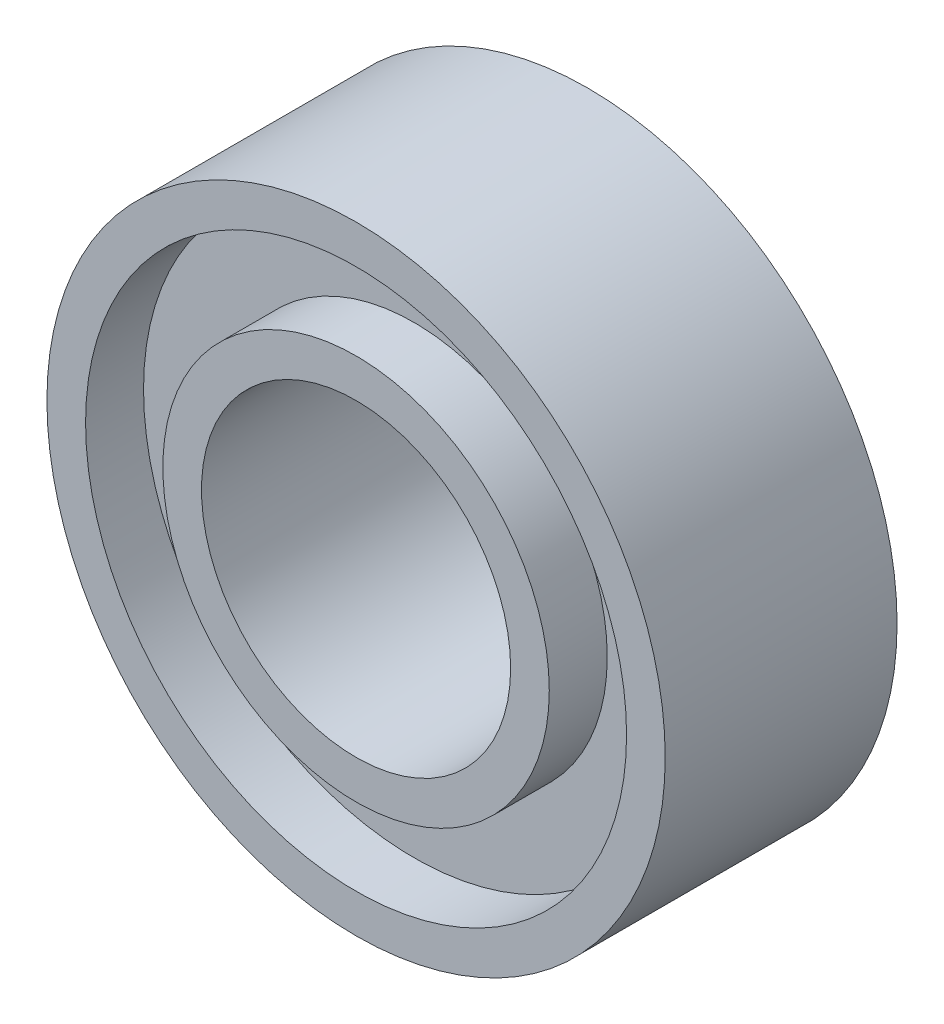
ISO-10303-21;
HEADER;
FILE_DESCRIPTION(('STEP AP214'),'2;1');
FILE_NAME('part.step','',(''),(''),'','','');
FILE_SCHEMA(('AUTOMOTIVE_DESIGN { 1 0 10303 214 1 1 1 1 }'));
ENDSEC;
DATA;
#1=APPLICATION_CONTEXT('core data for automotive mechanical design processes');
#2=APPLICATION_PROTOCOL_DEFINITION('international standard','automotive_design',2000,#1);
#3=PRODUCT_CONTEXT('',#1,'mechanical');
#4=PRODUCT('Part','Part','',(#3));
#5=PRODUCT_RELATED_PRODUCT_CATEGORY('part','',(#4));
#6=PRODUCT_DEFINITION_FORMATION('','',#4);
#7=PRODUCT_DEFINITION_CONTEXT('part definition',#1,'design');
#8=PRODUCT_DEFINITION('design','',#6,#7);
#9=PRODUCT_DEFINITION_SHAPE('','',#8);
#10=(LENGTH_UNIT() NAMED_UNIT(*) SI_UNIT(.MILLI.,.METRE.));
#11=(NAMED_UNIT(*) PLANE_ANGLE_UNIT() SI_UNIT($,.RADIAN.));
#12=(NAMED_UNIT(*) SI_UNIT($,.STERADIAN.) SOLID_ANGLE_UNIT());
#13=UNCERTAINTY_MEASURE_WITH_UNIT(LENGTH_MEASURE(1.E-05),#10,'distance_accuracy_value','');
#14=(GEOMETRIC_REPRESENTATION_CONTEXT(3) GLOBAL_UNCERTAINTY_ASSIGNED_CONTEXT((#13)) GLOBAL_UNIT_ASSIGNED_CONTEXT((#10,
#11,#12)) REPRESENTATION_CONTEXT('',''));
#15=CARTESIAN_POINT('',(0.,0.,0.));
#16=DIRECTION('',(0.,0.,1.));
#17=DIRECTION('',(1.,0.,0.));
#18=AXIS2_PLACEMENT_3D('',#15,#16,#17);
#19=CARTESIAN_POINT('',(0.,0.,0.));
#20=DIRECTION('',(0.,0.,1.));
#21=DIRECTION('',(1.,0.,0.));
#22=AXIS2_PLACEMENT_3D('',#19,#20,#21);
#23=PLANE('',#22);
#24=CARTESIAN_POINT('',(0.,0.,0.));
#25=DIRECTION('',(0.,0.,1.));
#26=DIRECTION('',(1.,0.,0.));
#27=AXIS2_PLACEMENT_3D('',#24,#25,#26);
#28=CIRCLE('',#27,4.);
#29=CARTESIAN_POINT('',(4.,0.,0.));
#30=VERTEX_POINT('',#29);
#31=EDGE_CURVE('E44',#30,#30,#28,.T.);
#32=ORIENTED_EDGE('',*,*,#31,.T.);
#33=EDGE_LOOP('',(#32));
#34=FACE_BOUND('',#33,.T.);
#35=CARTESIAN_POINT('',(0.,0.,0.));
#36=DIRECTION('',(0.,0.,1.));
#37=DIRECTION('',(1.,0.,0.));
#38=AXIS2_PLACEMENT_3D('',#35,#36,#37);
#39=CIRCLE('',#38,5.);
#40=CARTESIAN_POINT('',(5.,0.,0.));
#41=VERTEX_POINT('',#40);
#42=EDGE_CURVE('E68',#41,#41,#39,.T.);
#43=ORIENTED_EDGE('',*,*,#42,.F.);
#44=EDGE_LOOP('',(#43));
#45=FACE_BOUND('',#44,.T.);
#46=ADVANCED_FACE('F31',(#34,#45),#23,.F.);
#47=CARTESIAN_POINT('',(0.,0.,6.));
#48=DIRECTION('',(0.,0.,1.));
#49=DIRECTION('',(1.,0.,0.));
#50=AXIS2_PLACEMENT_3D('',#47,#48,#49);
#51=PLANE('',#50);
#52=CARTESIAN_POINT('',(0.,0.,6.));
#53=DIRECTION('',(0.,0.,1.));
#54=DIRECTION('',(1.,0.,0.));
#55=AXIS2_PLACEMENT_3D('',#52,#53,#54);
#56=CIRCLE('',#55,4.);
#57=CARTESIAN_POINT('',(4.,0.,6.));
#58=VERTEX_POINT('',#57);
#59=EDGE_CURVE('E42',#58,#58,#56,.T.);
#60=ORIENTED_EDGE('',*,*,#59,.F.);
#61=EDGE_LOOP('',(#60));
#62=FACE_BOUND('',#61,.T.);
#63=CARTESIAN_POINT('',(0.,0.,6.));
#64=DIRECTION('',(0.,0.,1.));
#65=DIRECTION('',(1.,0.,0.));
#66=AXIS2_PLACEMENT_3D('',#63,#64,#65);
#67=CIRCLE('',#66,5.);
#68=CARTESIAN_POINT('',(5.,0.,6.));
#69=VERTEX_POINT('',#68);
#70=EDGE_CURVE('E56',#69,#69,#67,.T.);
#71=ORIENTED_EDGE('',*,*,#70,.T.);
#72=EDGE_LOOP('',(#71));
#73=FACE_BOUND('',#72,.T.);
#74=ADVANCED_FACE('F84',(#62,#73),#51,.T.);
#75=CARTESIAN_POINT('',(0.,0.,6.));
#76=DIRECTION('',(0.,0.,1.));
#77=DIRECTION('',(1.,0.,0.));
#78=AXIS2_PLACEMENT_3D('',#75,#76,#77);
#79=CIRCLE('',#78,7.);
#80=CARTESIAN_POINT('',(7.,0.,6.));
#81=VERTEX_POINT('',#80);
#82=EDGE_CURVE('E50',#81,#81,#79,.T.);
#83=ORIENTED_EDGE('',*,*,#82,.F.);
#84=EDGE_LOOP('',(#83));
#85=FACE_BOUND('',#84,.T.);
#86=CARTESIAN_POINT('',(0.,0.,6.));
#87=DIRECTION('',(0.,0.,1.));
#88=DIRECTION('',(1.,0.,0.));
#89=AXIS2_PLACEMENT_3D('',#86,#87,#88);
#90=CIRCLE('',#89,8.);
#91=CARTESIAN_POINT('',(8.,0.,6.));
#92=VERTEX_POINT('',#91);
#93=EDGE_CURVE('E10',#92,#92,#90,.T.);
#94=ORIENTED_EDGE('',*,*,#93,.T.);
#95=EDGE_LOOP('',(#94));
#96=FACE_BOUND('',#95,.T.);
#97=ADVANCED_FACE('F90',(#85,#96),#51,.T.);
#98=CARTESIAN_POINT('',(0.,0.,0.));
#99=DIRECTION('',(0.,0.,1.));
#100=DIRECTION('',(1.,0.,0.));
#101=AXIS2_PLACEMENT_3D('',#98,#99,#100);
#102=CIRCLE('',#101,7.);
#103=CARTESIAN_POINT('',(7.,0.,0.));
#104=VERTEX_POINT('',#103);
#105=EDGE_CURVE('E62',#104,#104,#102,.T.);
#106=ORIENTED_EDGE('',*,*,#105,.T.);
#107=EDGE_LOOP('',(#106));
#108=FACE_BOUND('',#107,.T.);
#109=CARTESIAN_POINT('',(0.,0.,0.));
#110=DIRECTION('',(0.,0.,1.));
#111=DIRECTION('',(1.,0.,0.));
#112=AXIS2_PLACEMENT_3D('',#109,#110,#111);
#113=CIRCLE('',#112,8.);
#114=CARTESIAN_POINT('',(8.,0.,0.));
#115=VERTEX_POINT('',#114);
#116=EDGE_CURVE('E35',#115,#115,#113,.T.);
#117=ORIENTED_EDGE('',*,*,#116,.F.);
#118=EDGE_LOOP('',(#117));
#119=FACE_BOUND('',#118,.T.);
#120=ADVANCED_FACE('F86',(#108,#119),#23,.F.);
#121=CARTESIAN_POINT('',(0.,0.,6.));
#122=DIRECTION('',(0.,0.,-1.));
#123=DIRECTION('',(-1.,0.,0.));
#124=AXIS2_PLACEMENT_3D('',#121,#122,#123);
#125=CYLINDRICAL_SURFACE('',#124,8.);
#126=ORIENTED_EDGE('',*,*,#93,.F.);
#127=EDGE_LOOP('',(#126));
#128=FACE_BOUND('',#127,.T.);
#129=ORIENTED_EDGE('',*,*,#116,.T.);
#130=EDGE_LOOP('',(#129));
#131=FACE_BOUND('',#130,.T.);
#132=ADVANCED_FACE('F33',(#128,#131),#125,.T.);
#133=CARTESIAN_POINT('',(0.,0.,6.));
#134=DIRECTION('',(0.,0.,-1.));
#135=DIRECTION('',(-1.,0.,0.));
#136=AXIS2_PLACEMENT_3D('',#133,#134,#135);
#137=CYLINDRICAL_SURFACE('',#136,4.);
#138=ORIENTED_EDGE('',*,*,#59,.T.);
#139=EDGE_LOOP('',(#138));
#140=FACE_BOUND('',#139,.T.);
#141=ORIENTED_EDGE('',*,*,#31,.F.);
#142=EDGE_LOOP('',(#141));
#143=FACE_BOUND('',#142,.T.);
#144=ADVANCED_FACE('F99',(#140,#143),#137,.F.);
#145=CARTESIAN_POINT('',(0.,0.,4.5));
#146=DIRECTION('',(0.,0.,1.));
#147=DIRECTION('',(1.,0.,0.));
#148=AXIS2_PLACEMENT_3D('',#145,#146,#147);
#149=CYLINDRICAL_SURFACE('',#148,7.);
#150=CARTESIAN_POINT('',(0.,0.,4.5));
#151=DIRECTION('',(0.,0.,1.));
#152=DIRECTION('',(1.,0.,0.));
#153=AXIS2_PLACEMENT_3D('',#150,#151,#152);
#154=CIRCLE('',#153,7.);
#155=CARTESIAN_POINT('',(7.,0.,4.5));
#156=VERTEX_POINT('',#155);
#157=EDGE_CURVE('E47',#156,#156,#154,.T.);
#158=ORIENTED_EDGE('',*,*,#157,.F.);
#159=EDGE_LOOP('',(#158));
#160=FACE_BOUND('',#159,.T.);
#161=ORIENTED_EDGE('',*,*,#82,.T.);
#162=EDGE_LOOP('',(#161));
#163=FACE_BOUND('',#162,.T.);
#164=ADVANCED_FACE('F123',(#160,#163),#149,.F.);
#165=CARTESIAN_POINT('',(0.,0.,4.5));
#166=DIRECTION('',(0.,0.,1.));
#167=DIRECTION('',(1.,0.,0.));
#168=AXIS2_PLACEMENT_3D('',#165,#166,#167);
#169=PLANE('',#168);
#170=CARTESIAN_POINT('',(0.,0.,4.5));
#171=DIRECTION('',(0.,0.,1.));
#172=DIRECTION('',(1.,0.,0.));
#173=AXIS2_PLACEMENT_3D('',#170,#171,#172);
#174=CIRCLE('',#173,5.);
#175=CARTESIAN_POINT('',(5.,0.,4.5));
#176=VERTEX_POINT('',#175);
#177=EDGE_CURVE('E53',#176,#176,#174,.T.);
#178=ORIENTED_EDGE('',*,*,#177,.F.);
#179=EDGE_LOOP('',(#178));
#180=FACE_BOUND('',#179,.T.);
#181=ORIENTED_EDGE('',*,*,#157,.T.);
#182=EDGE_LOOP('',(#181));
#183=FACE_BOUND('',#182,.T.);
#184=ADVANCED_FACE('F119',(#180,#183),#169,.T.);
#185=CARTESIAN_POINT('',(0.,0.,4.5));
#186=DIRECTION('',(0.,0.,1.));
#187=DIRECTION('',(1.,0.,0.));
#188=AXIS2_PLACEMENT_3D('',#185,#186,#187);
#189=CYLINDRICAL_SURFACE('',#188,5.);
#190=ORIENTED_EDGE('',*,*,#177,.T.);
#191=EDGE_LOOP('',(#190));
#192=FACE_BOUND('',#191,.T.);
#193=ORIENTED_EDGE('',*,*,#70,.F.);
#194=EDGE_LOOP('',(#193));
#195=FACE_BOUND('',#194,.T.);
#196=ADVANCED_FACE('F113',(#192,#195),#189,.T.);
#197=CARTESIAN_POINT('',(0.,0.,1.5));
#198=DIRECTION('',(0.,0.,-1.));
#199=DIRECTION('',(1.,0.,0.));
#200=AXIS2_PLACEMENT_3D('',#197,#198,#199);
#201=PLANE('',#200);
#202=CARTESIAN_POINT('',(0.,0.,1.5));
#203=DIRECTION('',(0.,0.,1.));
#204=DIRECTION('',(1.,0.,0.));
#205=AXIS2_PLACEMENT_3D('',#202,#203,#204);
#206=CIRCLE('',#205,7.);
#207=CARTESIAN_POINT('',(7.,0.,1.5));
#208=VERTEX_POINT('',#207);
#209=EDGE_CURVE('E59',#208,#208,#206,.T.);
#210=ORIENTED_EDGE('',*,*,#209,.F.);
#211=EDGE_LOOP('',(#210));
#212=FACE_BOUND('',#211,.T.);
#213=CARTESIAN_POINT('',(0.,0.,1.5));
#214=DIRECTION('',(0.,0.,1.));
#215=DIRECTION('',(1.,0.,0.));
#216=AXIS2_PLACEMENT_3D('',#213,#214,#215);
#217=CIRCLE('',#216,5.);
#218=CARTESIAN_POINT('',(5.,0.,1.5));
#219=VERTEX_POINT('',#218);
#220=EDGE_CURVE('E65',#219,#219,#217,.T.);
#221=ORIENTED_EDGE('',*,*,#220,.T.);
#222=EDGE_LOOP('',(#221));
#223=FACE_BOUND('',#222,.T.);
#224=ADVANCED_FACE('F74',(#212,#223),#201,.T.);
#225=CARTESIAN_POINT('',(0.,0.,1.5));
#226=DIRECTION('',(0.,0.,-1.));
#227=DIRECTION('',(-1.,0.,0.));
#228=AXIS2_PLACEMENT_3D('',#225,#226,#227);
#229=CYLINDRICAL_SURFACE('',#228,7.);
#230=ORIENTED_EDGE('',*,*,#209,.T.);
#231=EDGE_LOOP('',(#230));
#232=FACE_BOUND('',#231,.T.);
#233=ORIENTED_EDGE('',*,*,#105,.F.);
#234=EDGE_LOOP('',(#233));
#235=FACE_BOUND('',#234,.T.);
#236=ADVANCED_FACE('F79',(#232,#235),#229,.F.);
#237=CARTESIAN_POINT('',(0.,0.,1.5));
#238=DIRECTION('',(0.,0.,-1.));
#239=DIRECTION('',(-1.,0.,0.));
#240=AXIS2_PLACEMENT_3D('',#237,#238,#239);
#241=CYLINDRICAL_SURFACE('',#240,5.);
#242=ORIENTED_EDGE('',*,*,#220,.F.);
#243=EDGE_LOOP('',(#242));
#244=FACE_BOUND('',#243,.T.);
#245=ORIENTED_EDGE('',*,*,#42,.T.);
#246=EDGE_LOOP('',(#245));
#247=FACE_BOUND('',#246,.T.);
#248=ADVANCED_FACE('F76',(#244,#247),#241,.T.);
#249=CLOSED_SHELL('',(#46,#74,#97,#120,#132,#144,#164,#184,#196,#224,#236,#248));
#250=MANIFOLD_SOLID_BREP('B2',#249);
#251=ADVANCED_BREP_SHAPE_REPRESENTATION('',(#18,#250),#14);
#252=SHAPE_DEFINITION_REPRESENTATION(#9,#251);
ENDSEC;
END-ISO-10303-21;
